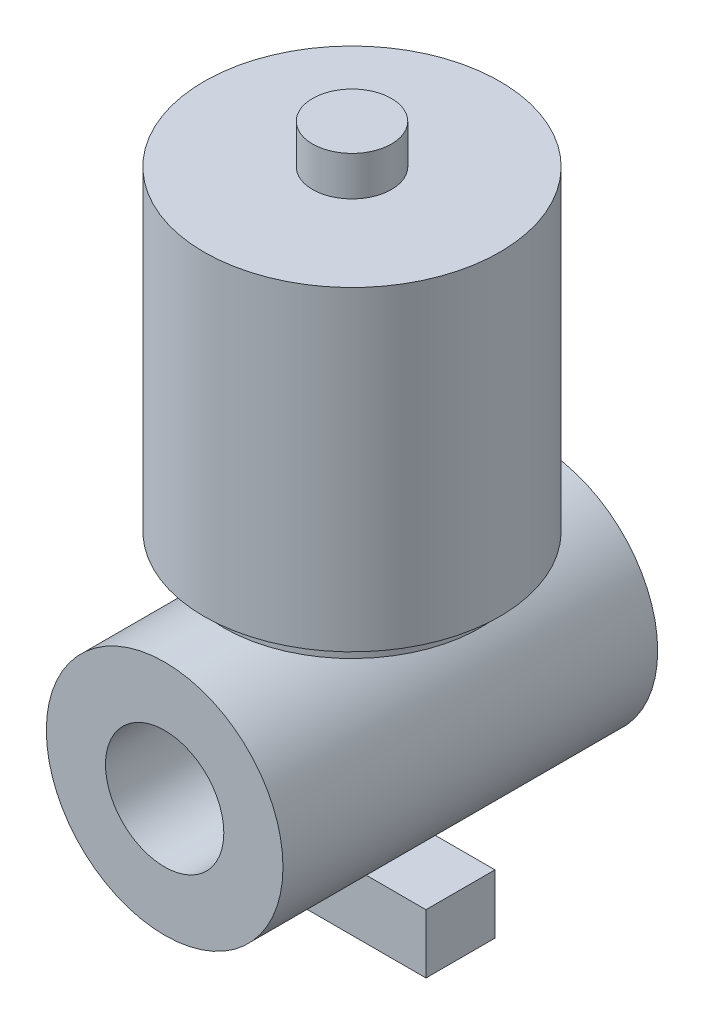
ISO-10303-21;
HEADER;
FILE_DESCRIPTION(('STEP AP214'),'2;1');
FILE_NAME('part.step','',(''),(''),'','','');
FILE_SCHEMA(('AUTOMOTIVE_DESIGN { 1 0 10303 214 1 1 1 1 }'));
ENDSEC;
DATA;
#1=APPLICATION_CONTEXT('core data for automotive mechanical design processes');
#2=APPLICATION_PROTOCOL_DEFINITION('international standard','automotive_design',2000,#1);
#3=PRODUCT_CONTEXT('',#1,'mechanical');
#4=PRODUCT('Part','Part','',(#3));
#5=PRODUCT_RELATED_PRODUCT_CATEGORY('part','',(#4));
#6=PRODUCT_DEFINITION_FORMATION('','',#4);
#7=PRODUCT_DEFINITION_CONTEXT('part definition',#1,'design');
#8=PRODUCT_DEFINITION('design','',#6,#7);
#9=PRODUCT_DEFINITION_SHAPE('','',#8);
#10=(LENGTH_UNIT() NAMED_UNIT(*) SI_UNIT(.MILLI.,.METRE.));
#11=(NAMED_UNIT(*) PLANE_ANGLE_UNIT() SI_UNIT($,.RADIAN.));
#12=(NAMED_UNIT(*) SI_UNIT($,.STERADIAN.) SOLID_ANGLE_UNIT());
#13=UNCERTAINTY_MEASURE_WITH_UNIT(LENGTH_MEASURE(1.E-05),#10,'distance_accuracy_value','');
#14=(GEOMETRIC_REPRESENTATION_CONTEXT(3) GLOBAL_UNCERTAINTY_ASSIGNED_CONTEXT((#13)) GLOBAL_UNIT_ASSIGNED_CONTEXT((#10,
#11,#12)) REPRESENTATION_CONTEXT('',''));
#15=CARTESIAN_POINT('',(0.,0.,0.));
#16=DIRECTION('',(0.,0.,1.));
#17=DIRECTION('',(1.,0.,0.));
#18=AXIS2_PLACEMENT_3D('',#15,#16,#17);
#19=CARTESIAN_POINT('',(0.,-32.,-3.5));
#20=DIRECTION('',(0.,-1.,0.));
#21=DIRECTION('',(1.,0.,0.));
#22=AXIS2_PLACEMENT_3D('',#19,#20,#21);
#23=PLANE('',#22);
#24=CARTESIAN_POINT('',(-5.99999999999999,-32.,0.));
#25=DIRECTION('',(0.,-1.,0.));
#26=DIRECTION('',(1.,0.,0.));
#27=AXIS2_PLACEMENT_3D('',#24,#25,#26);
#28=CIRCLE('',#27,2.);
#29=CARTESIAN_POINT('',(-3.99999999999999,-32.,0.));
#30=VERTEX_POINT('',#29);
#31=EDGE_CURVE('E140',#30,#30,#28,.T.);
#32=ORIENTED_EDGE('',*,*,#31,.F.);
#33=EDGE_LOOP('',(#32));
#34=FACE_BOUND('',#33,.T.);
#35=CARTESIAN_POINT('',(6.00000000000001,-32.,0.));
#36=DIRECTION('',(0.,-1.,0.));
#37=DIRECTION('',(1.,0.,0.));
#38=AXIS2_PLACEMENT_3D('',#35,#36,#37);
#39=CIRCLE('',#38,2.);
#40=CARTESIAN_POINT('',(8.00000000000001,-32.,0.));
#41=VERTEX_POINT('',#40);
#42=EDGE_CURVE('E105',#41,#41,#39,.T.);
#43=ORIENTED_EDGE('',*,*,#42,.F.);
#44=EDGE_LOOP('',(#43));
#45=FACE_BOUND('',#44,.T.);
#46=DIRECTION('',(0.,0.,1.));
#47=VECTOR('',#46,1.);
#48=CARTESIAN_POINT('',(11.,-32.,-3.5));
#49=LINE('',#48,#47);
#50=CARTESIAN_POINT('',(11.,-32.,-3.5));
#51=VERTEX_POINT('',#50);
#52=CARTESIAN_POINT('',(11.,-32.,3.5));
#53=VERTEX_POINT('',#52);
#54=EDGE_CURVE('E46',#51,#53,#49,.T.);
#55=ORIENTED_EDGE('',*,*,#54,.T.);
#56=DIRECTION('',(1.,0.,0.));
#57=VECTOR('',#56,1.);
#58=CARTESIAN_POINT('',(0.,-32.,3.5));
#59=LINE('',#58,#57);
#60=CARTESIAN_POINT('',(-11.,-32.,3.5));
#61=VERTEX_POINT('',#60);
#62=EDGE_CURVE('E83',#61,#53,#59,.T.);
#63=ORIENTED_EDGE('',*,*,#62,.F.);
#64=DIRECTION('',(0.,0.,1.));
#65=VECTOR('',#64,1.);
#66=CARTESIAN_POINT('',(-11.,-32.,-3.5));
#67=LINE('',#66,#65);
#68=CARTESIAN_POINT('',(-11.,-32.,-3.5));
#69=VERTEX_POINT('',#68);
#70=EDGE_CURVE('E12',#69,#61,#67,.T.);
#71=ORIENTED_EDGE('',*,*,#70,.F.);
#72=DIRECTION('',(1.,0.,0.));
#73=VECTOR('',#72,1.);
#74=CARTESIAN_POINT('',(0.,-32.,-3.5));
#75=LINE('',#74,#73);
#76=EDGE_CURVE('E85',#69,#51,#75,.T.);
#77=ORIENTED_EDGE('',*,*,#76,.T.);
#78=EDGE_LOOP('',(#55,#63,#71,#77));
#79=FACE_BOUND('',#78,.T.);
#80=ADVANCED_FACE('F43',(#34,#45,#79),#23,.T.);
#81=CARTESIAN_POINT('',(-11.,0.,-3.5));
#82=DIRECTION('',(1.,0.,0.));
#83=DIRECTION('',(0.,1.,0.));
#84=AXIS2_PLACEMENT_3D('',#81,#82,#83);
#85=PLANE('',#84);
#86=ORIENTED_EDGE('',*,*,#70,.T.);
#87=DIRECTION('',(0.,1.,0.));
#88=VECTOR('',#87,1.);
#89=CARTESIAN_POINT('',(-11.,0.,3.5));
#90=LINE('',#89,#88);
#91=CARTESIAN_POINT('',(-11.,-26.,3.5));
#92=VERTEX_POINT('',#91);
#93=EDGE_CURVE('E101',#61,#92,#90,.T.);
#94=ORIENTED_EDGE('',*,*,#93,.T.);
#95=DIRECTION('',(0.,0.,1.));
#96=VECTOR('',#95,1.);
#97=CARTESIAN_POINT('',(-11.,-26.,-3.5));
#98=LINE('',#97,#96);
#99=CARTESIAN_POINT('',(-11.,-26.,-3.5));
#100=VERTEX_POINT('',#99);
#101=EDGE_CURVE('E51',#100,#92,#98,.T.);
#102=ORIENTED_EDGE('',*,*,#101,.F.);
#103=DIRECTION('',(0.,1.,0.));
#104=VECTOR('',#103,1.);
#105=CARTESIAN_POINT('',(-11.,0.,-3.5));
#106=LINE('',#105,#104);
#107=EDGE_CURVE('E64',#69,#100,#106,.T.);
#108=ORIENTED_EDGE('',*,*,#107,.F.);
#109=EDGE_LOOP('',(#86,#94,#102,#108));
#110=FACE_BOUND('',#109,.T.);
#111=ADVANCED_FACE('F121',(#110),#85,.F.);
#112=CARTESIAN_POINT('',(0.,-26.,-3.5));
#113=DIRECTION('',(0.,-1.,0.));
#114=DIRECTION('',(1.,0.,0.));
#115=AXIS2_PLACEMENT_3D('',#112,#113,#114);
#116=PLANE('',#115);
#117=ORIENTED_EDGE('',*,*,#101,.T.);
#118=DIRECTION('',(1.,0.,0.));
#119=VECTOR('',#118,1.);
#120=CARTESIAN_POINT('',(0.,-26.,3.5));
#121=LINE('',#120,#119);
#122=CARTESIAN_POINT('',(11.,-26.,3.5));
#123=VERTEX_POINT('',#122);
#124=EDGE_CURVE('E97',#92,#123,#121,.T.);
#125=ORIENTED_EDGE('',*,*,#124,.T.);
#126=DIRECTION('',(0.,0.,1.));
#127=VECTOR('',#126,1.);
#128=CARTESIAN_POINT('',(11.,-26.,-3.5));
#129=LINE('',#128,#127);
#130=CARTESIAN_POINT('',(11.,-26.,-3.5));
#131=VERTEX_POINT('',#130);
#132=EDGE_CURVE('E89',#131,#123,#129,.T.);
#133=ORIENTED_EDGE('',*,*,#132,.F.);
#134=DIRECTION('',(1.,0.,0.));
#135=VECTOR('',#134,1.);
#136=CARTESIAN_POINT('',(0.,-26.,-3.5));
#137=LINE('',#136,#135);
#138=EDGE_CURVE('E114',#100,#131,#137,.T.);
#139=ORIENTED_EDGE('',*,*,#138,.F.);
#140=EDGE_LOOP('',(#117,#125,#133,#139));
#141=FACE_BOUND('',#140,.T.);
#142=ADVANCED_FACE('F119',(#141),#116,.F.);
#143=CARTESIAN_POINT('',(11.,0.,-3.5));
#144=DIRECTION('',(1.,0.,0.));
#145=DIRECTION('',(0.,0.,-1.));
#146=AXIS2_PLACEMENT_3D('',#143,#144,#145);
#147=PLANE('',#146);
#148=ORIENTED_EDGE('',*,*,#132,.T.);
#149=DIRECTION('',(0.,1.,0.));
#150=VECTOR('',#149,1.);
#151=CARTESIAN_POINT('',(11.,0.,3.5));
#152=LINE('',#151,#150);
#153=EDGE_CURVE('E91',#53,#123,#152,.T.);
#154=ORIENTED_EDGE('',*,*,#153,.F.);
#155=ORIENTED_EDGE('',*,*,#54,.F.);
#156=DIRECTION('',(0.,1.,0.));
#157=VECTOR('',#156,1.);
#158=CARTESIAN_POINT('',(11.,0.,-3.5));
#159=LINE('',#158,#157);
#160=EDGE_CURVE('E112',#51,#131,#159,.T.);
#161=ORIENTED_EDGE('',*,*,#160,.T.);
#162=EDGE_LOOP('',(#148,#154,#155,#161));
#163=FACE_BOUND('',#162,.T.);
#164=ADVANCED_FACE('F92',(#163),#147,.T.);
#165=CARTESIAN_POINT('',(0.,0.,-3.5));
#166=DIRECTION('',(0.,0.,1.));
#167=DIRECTION('',(1.,0.,0.));
#168=AXIS2_PLACEMENT_3D('',#165,#166,#167);
#169=PLANE('',#168);
#170=ORIENTED_EDGE('',*,*,#76,.F.);
#171=ORIENTED_EDGE('',*,*,#107,.T.);
#172=ORIENTED_EDGE('',*,*,#138,.T.);
#173=ORIENTED_EDGE('',*,*,#160,.F.);
#174=EDGE_LOOP('',(#170,#171,#172,#173));
#175=FACE_BOUND('',#174,.T.);
#176=ADVANCED_FACE('F122',(#175),#169,.F.);
#177=CARTESIAN_POINT('',(0.,0.,3.5));
#178=DIRECTION('',(0.,0.,1.));
#179=DIRECTION('',(1.,0.,0.));
#180=AXIS2_PLACEMENT_3D('',#177,#178,#179);
#181=PLANE('',#180);
#182=ORIENTED_EDGE('',*,*,#62,.T.);
#183=ORIENTED_EDGE('',*,*,#153,.T.);
#184=ORIENTED_EDGE('',*,*,#124,.F.);
#185=ORIENTED_EDGE('',*,*,#93,.F.);
#186=EDGE_LOOP('',(#182,#183,#184,#185));
#187=FACE_BOUND('',#186,.T.);
#188=ADVANCED_FACE('F99',(#187),#181,.T.);
#189=CARTESIAN_POINT('',(6.00000000000001,-29.,0.));
#190=DIRECTION('',(0.,-1.,0.));
#191=DIRECTION('',(1.,0.,0.));
#192=AXIS2_PLACEMENT_3D('',#189,#190,#191);
#193=CYLINDRICAL_SURFACE('',#192,2.);
#194=CARTESIAN_POINT('',(6.00000000000001,-29.,0.));
#195=DIRECTION('',(0.,-1.,0.));
#196=DIRECTION('',(1.,0.,0.));
#197=AXIS2_PLACEMENT_3D('',#194,#195,#196);
#198=CIRCLE('',#197,2.);
#199=CARTESIAN_POINT('',(8.00000000000001,-29.,0.));
#200=VERTEX_POINT('',#199);
#201=EDGE_CURVE('E102',#200,#200,#198,.T.);
#202=ORIENTED_EDGE('',*,*,#201,.F.);
#203=EDGE_LOOP('',(#202));
#204=FACE_BOUND('',#203,.T.);
#205=ORIENTED_EDGE('',*,*,#42,.T.);
#206=EDGE_LOOP('',(#205));
#207=FACE_BOUND('',#206,.T.);
#208=ADVANCED_FACE('F129',(#204,#207),#193,.F.);
#209=CARTESIAN_POINT('',(6.00000000000001,-29.,0.));
#210=DIRECTION('',(0.,-1.,0.));
#211=DIRECTION('',(1.,0.,0.));
#212=AXIS2_PLACEMENT_3D('',#209,#210,#211);
#213=PLANE('',#212);
#214=ORIENTED_EDGE('',*,*,#201,.T.);
#215=EDGE_LOOP('',(#214));
#216=FACE_BOUND('',#215,.T.);
#217=ADVANCED_FACE('F154',(#216),#213,.T.);
#218=CARTESIAN_POINT('',(-5.99999999999999,-29.,0.));
#219=DIRECTION('',(0.,-1.,0.));
#220=DIRECTION('',(1.,0.,0.));
#221=AXIS2_PLACEMENT_3D('',#218,#219,#220);
#222=CYLINDRICAL_SURFACE('',#221,2.);
#223=CARTESIAN_POINT('',(-5.99999999999999,-29.,0.));
#224=DIRECTION('',(0.,-1.,0.));
#225=DIRECTION('',(1.,0.,0.));
#226=AXIS2_PLACEMENT_3D('',#223,#224,#225);
#227=CIRCLE('',#226,2.);
#228=CARTESIAN_POINT('',(-3.99999999999999,-29.,0.));
#229=VERTEX_POINT('',#228);
#230=EDGE_CURVE('E144',#229,#229,#227,.T.);
#231=ORIENTED_EDGE('',*,*,#230,.F.);
#232=EDGE_LOOP('',(#231));
#233=FACE_BOUND('',#232,.T.);
#234=ORIENTED_EDGE('',*,*,#31,.T.);
#235=EDGE_LOOP('',(#234));
#236=FACE_BOUND('',#235,.T.);
#237=ADVANCED_FACE('F151',(#233,#236),#222,.F.);
#238=CARTESIAN_POINT('',(0.,-29.,0.));
#239=DIRECTION('',(0.,-1.,0.));
#240=DIRECTION('',(1.,0.,0.));
#241=AXIS2_PLACEMENT_3D('',#238,#239,#240);
#242=PLANE('',#241);
#243=ORIENTED_EDGE('',*,*,#230,.T.);
#244=EDGE_LOOP('',(#243));
#245=FACE_BOUND('',#244,.T.);
#246=ADVANCED_FACE('F153',(#245),#242,.T.);
#247=CLOSED_SHELL('',(#80,#111,#142,#164,#176,#188,#208,#217,#237,#246));
#248=MANIFOLD_SOLID_BREP('B2',#247);
#249=CARTESIAN_POINT('',(0.,-14.,-19.));
#250=DIRECTION('',(0.,0.,1.));
#251=DIRECTION('',(1.,0.,0.));
#252=AXIS2_PLACEMENT_3D('',#249,#250,#251);
#253=CYLINDRICAL_SURFACE('',#252,12.);
#254=CARTESIAN_POINT('',(0.,-14.,-19.));
#255=DIRECTION('',(0.,0.,1.));
#256=DIRECTION('',(1.,0.,0.));
#257=AXIS2_PLACEMENT_3D('',#254,#255,#256);
#258=CIRCLE('',#257,12.);
#259=CARTESIAN_POINT('',(12.,-14.,-19.));
#260=VERTEX_POINT('',#259);
#261=EDGE_CURVE('E42',#260,#260,#258,.T.);
#262=ORIENTED_EDGE('',*,*,#261,.T.);
#263=EDGE_LOOP('',(#262));
#264=FACE_BOUND('',#263,.T.);
#265=CARTESIAN_POINT('',(0.,-14.,19.));
#266=DIRECTION('',(0.,0.,1.));
#267=DIRECTION('',(1.,0.,0.));
#268=AXIS2_PLACEMENT_3D('',#265,#266,#267);
#269=CIRCLE('',#268,12.);
#270=CARTESIAN_POINT('',(12.,-14.,19.));
#271=VERTEX_POINT('',#270);
#272=EDGE_CURVE('E239',#271,#271,#269,.T.);
#273=ORIENTED_EDGE('',*,*,#272,.F.);
#274=EDGE_LOOP('',(#273));
#275=FACE_BOUND('',#274,.T.);
#276=ADVANCED_FACE('F233',(#264,#275),#253,.T.);
#277=CARTESIAN_POINT('',(0.,0.,-19.));
#278=DIRECTION('',(0.,0.,1.));
#279=DIRECTION('',(1.,0.,0.));
#280=AXIS2_PLACEMENT_3D('',#277,#278,#279);
#281=PLANE('',#280);
#282=CARTESIAN_POINT('',(0.,-14.,-19.));
#283=DIRECTION('',(0.,0.,1.));
#284=DIRECTION('',(1.,0.,0.));
#285=AXIS2_PLACEMENT_3D('',#282,#283,#284);
#286=CIRCLE('',#285,6.);
#287=CARTESIAN_POINT('',(6.,-14.,-19.));
#288=VERTEX_POINT('',#287);
#289=EDGE_CURVE('E243',#288,#288,#286,.T.);
#290=ORIENTED_EDGE('',*,*,#289,.T.);
#291=EDGE_LOOP('',(#290));
#292=FACE_BOUND('',#291,.T.);
#293=ORIENTED_EDGE('',*,*,#261,.F.);
#294=EDGE_LOOP('',(#293));
#295=FACE_BOUND('',#294,.T.);
#296=ADVANCED_FACE('F257',(#292,#295),#281,.F.);
#297=CARTESIAN_POINT('',(0.,0.,19.));
#298=DIRECTION('',(0.,0.,1.));
#299=DIRECTION('',(1.,0.,0.));
#300=AXIS2_PLACEMENT_3D('',#297,#298,#299);
#301=PLANE('',#300);
#302=CARTESIAN_POINT('',(0.,-14.,19.));
#303=DIRECTION('',(0.,0.,1.));
#304=DIRECTION('',(1.,0.,0.));
#305=AXIS2_PLACEMENT_3D('',#302,#303,#304);
#306=CIRCLE('',#305,6.);
#307=CARTESIAN_POINT('',(6.,-14.,19.));
#308=VERTEX_POINT('',#307);
#309=EDGE_CURVE('E247',#308,#308,#306,.T.);
#310=ORIENTED_EDGE('',*,*,#309,.F.);
#311=EDGE_LOOP('',(#310));
#312=FACE_BOUND('',#311,.T.);
#313=ORIENTED_EDGE('',*,*,#272,.T.);
#314=EDGE_LOOP('',(#313));
#315=FACE_BOUND('',#314,.T.);
#316=ADVANCED_FACE('F255',(#312,#315),#301,.T.);
#317=CARTESIAN_POINT('',(0.,-14.,-19.));
#318=DIRECTION('',(0.,0.,1.));
#319=DIRECTION('',(1.,0.,0.));
#320=AXIS2_PLACEMENT_3D('',#317,#318,#319);
#321=CYLINDRICAL_SURFACE('',#320,6.);
#322=ORIENTED_EDGE('',*,*,#289,.F.);
#323=EDGE_LOOP('',(#322));
#324=FACE_BOUND('',#323,.T.);
#325=ORIENTED_EDGE('',*,*,#309,.T.);
#326=EDGE_LOOP('',(#325));
#327=FACE_BOUND('',#326,.T.);
#328=ADVANCED_FACE('F253',(#324,#327),#321,.F.);
#329=CLOSED_SHELL('',(#276,#296,#316,#328));
#330=MANIFOLD_SOLID_BREP('B6',#329);
#331=CARTESIAN_POINT('',(0.,32.,0.));
#332=DIRECTION('',(0.,-1.,0.));
#333=DIRECTION('',(0.,0.,-1.));
#334=AXIS2_PLACEMENT_3D('',#331,#332,#333);
#335=CYLINDRICAL_SURFACE('',#334,15.);
#336=CARTESIAN_POINT('',(0.,32.,0.));
#337=DIRECTION('',(0.,1.,0.));
#338=DIRECTION('',(0.,0.,1.));
#339=AXIS2_PLACEMENT_3D('',#336,#337,#338);
#340=CIRCLE('',#339,15.);
#341=CARTESIAN_POINT('',(0.,32.,15.));
#342=VERTEX_POINT('',#341);
#343=EDGE_CURVE('E307',#342,#342,#340,.T.);
#344=ORIENTED_EDGE('',*,*,#343,.F.);
#345=EDGE_LOOP('',(#344));
#346=FACE_BOUND('',#345,.T.);
#347=CARTESIAN_POINT('',(0.,0.,0.));
#348=DIRECTION('',(0.,1.,0.));
#349=DIRECTION('',(0.,0.,1.));
#350=AXIS2_PLACEMENT_3D('',#347,#348,#349);
#351=CIRCLE('',#350,15.);
#352=CARTESIAN_POINT('',(0.,0.,15.));
#353=VERTEX_POINT('',#352);
#354=EDGE_CURVE('E298',#353,#353,#351,.T.);
#355=ORIENTED_EDGE('',*,*,#354,.T.);
#356=EDGE_LOOP('',(#355));
#357=FACE_BOUND('',#356,.T.);
#358=ADVANCED_FACE('F295',(#346,#357),#335,.T.);
#359=CARTESIAN_POINT('',(0.,32.,0.));
#360=DIRECTION('',(0.,1.,0.));
#361=DIRECTION('',(0.,0.,1.));
#362=AXIS2_PLACEMENT_3D('',#359,#360,#361);
#363=PLANE('',#362);
#364=CARTESIAN_POINT('',(0.,32.,0.));
#365=DIRECTION('',(0.,1.,0.));
#366=DIRECTION('',(0.,0.,1.));
#367=AXIS2_PLACEMENT_3D('',#364,#365,#366);
#368=CIRCLE('',#367,4.);
#369=CARTESIAN_POINT('',(0.,32.,4.));
#370=VERTEX_POINT('',#369);
#371=EDGE_CURVE('E302',#370,#370,#368,.T.);
#372=ORIENTED_EDGE('',*,*,#371,.F.);
#373=EDGE_LOOP('',(#372));
#374=FACE_BOUND('',#373,.T.);
#375=ORIENTED_EDGE('',*,*,#343,.T.);
#376=EDGE_LOOP('',(#375));
#377=FACE_BOUND('',#376,.T.);
#378=ADVANCED_FACE('F324',(#374,#377),#363,.T.);
#379=CARTESIAN_POINT('',(0.,0.,0.));
#380=DIRECTION('',(0.,1.,0.));
#381=DIRECTION('',(0.,0.,1.));
#382=AXIS2_PLACEMENT_3D('',#379,#380,#381);
#383=PLANE('',#382);
#384=CARTESIAN_POINT('',(0.,0.,0.));
#385=DIRECTION('',(0.,-1.,0.));
#386=DIRECTION('',(0.,0.,-1.));
#387=AXIS2_PLACEMENT_3D('',#384,#385,#386);
#388=CIRCLE('',#387,13.);
#389=CARTESIAN_POINT('',(0.,0.,-13.));
#390=VERTEX_POINT('',#389);
#391=EDGE_CURVE('E232',#390,#390,#388,.T.);
#392=ORIENTED_EDGE('',*,*,#391,.F.);
#393=EDGE_LOOP('',(#392));
#394=FACE_BOUND('',#393,.T.);
#395=ORIENTED_EDGE('',*,*,#354,.F.);
#396=EDGE_LOOP('',(#395));
#397=FACE_BOUND('',#396,.T.);
#398=ADVANCED_FACE('F321',(#394,#397),#383,.F.);
#399=CARTESIAN_POINT('',(0.,36.,0.));
#400=DIRECTION('',(0.,-1.,0.));
#401=DIRECTION('',(0.,0.,-1.));
#402=AXIS2_PLACEMENT_3D('',#399,#400,#401);
#403=CYLINDRICAL_SURFACE('',#402,4.);
#404=CARTESIAN_POINT('',(0.,36.,0.));
#405=DIRECTION('',(0.,1.,0.));
#406=DIRECTION('',(0.,0.,1.));
#407=AXIS2_PLACEMENT_3D('',#404,#405,#406);
#408=CIRCLE('',#407,4.);
#409=CARTESIAN_POINT('',(0.,36.,4.));
#410=VERTEX_POINT('',#409);
#411=EDGE_CURVE('E312',#410,#410,#408,.T.);
#412=ORIENTED_EDGE('',*,*,#411,.F.);
#413=EDGE_LOOP('',(#412));
#414=FACE_BOUND('',#413,.T.);
#415=ORIENTED_EDGE('',*,*,#371,.T.);
#416=EDGE_LOOP('',(#415));
#417=FACE_BOUND('',#416,.T.);
#418=ADVANCED_FACE('F323',(#414,#417),#403,.T.);
#419=CARTESIAN_POINT('',(0.,36.,0.));
#420=DIRECTION('',(0.,1.,0.));
#421=DIRECTION('',(0.,0.,1.));
#422=AXIS2_PLACEMENT_3D('',#419,#420,#421);
#423=PLANE('',#422);
#424=ORIENTED_EDGE('',*,*,#411,.T.);
#425=EDGE_LOOP('',(#424));
#426=FACE_BOUND('',#425,.T.);
#427=ADVANCED_FACE('F330',(#426),#423,.T.);
#428=CARTESIAN_POINT('',(0.,-2.,0.));
#429=DIRECTION('',(0.,1.,0.));
#430=DIRECTION('',(0.,0.,1.));
#431=AXIS2_PLACEMENT_3D('',#428,#429,#430);
#432=CYLINDRICAL_SURFACE('',#431,13.);
#433=CARTESIAN_POINT('',(0.,-2.,0.));
#434=DIRECTION('',(0.,-1.,0.));
#435=DIRECTION('',(0.,0.,-1.));
#436=AXIS2_PLACEMENT_3D('',#433,#434,#435);
#437=CIRCLE('',#436,13.);
#438=CARTESIAN_POINT('',(0.,-2.,-13.));
#439=VERTEX_POINT('',#438);
#440=EDGE_CURVE('E311',#439,#439,#437,.T.);
#441=ORIENTED_EDGE('',*,*,#440,.F.);
#442=EDGE_LOOP('',(#441));
#443=FACE_BOUND('',#442,.T.);
#444=ORIENTED_EDGE('',*,*,#391,.T.);
#445=EDGE_LOOP('',(#444));
#446=FACE_BOUND('',#445,.T.);
#447=ADVANCED_FACE('F358',(#443,#446),#432,.T.);
#448=CARTESIAN_POINT('',(0.,-2.,0.));
#449=DIRECTION('',(0.,-1.,0.));
#450=DIRECTION('',(0.,0.,-1.));
#451=AXIS2_PLACEMENT_3D('',#448,#449,#450);
#452=PLANE('',#451);
#453=ORIENTED_EDGE('',*,*,#440,.T.);
#454=EDGE_LOOP('',(#453));
#455=FACE_BOUND('',#454,.T.);
#456=ADVANCED_FACE('F371',(#455),#452,.T.);
#457=CLOSED_SHELL('',(#358,#378,#398,#418,#427,#447,#456));
#458=MANIFOLD_SOLID_BREP('B37',#457);
#459=ADVANCED_BREP_SHAPE_REPRESENTATION('',(#18,#248,#330,#458),#14);
#460=SHAPE_DEFINITION_REPRESENTATION(#9,#459);
ENDSEC;
END-ISO-10303-21;
